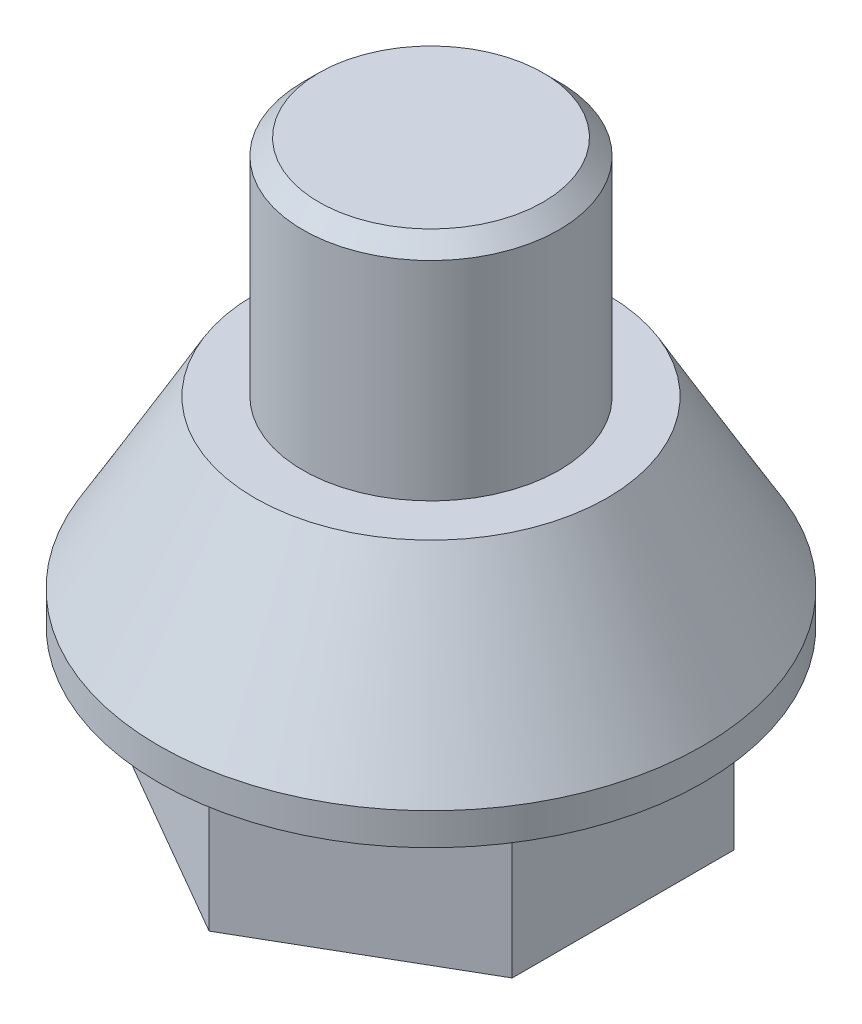
ISO-10303-21;
HEADER;
FILE_DESCRIPTION(('STEP AP214'),'2;1');
FILE_NAME('part.step','',(''),(''),'','','');
FILE_SCHEMA(('AUTOMOTIVE_DESIGN { 1 0 10303 214 1 1 1 1 }'));
ENDSEC;
DATA;
#1=APPLICATION_CONTEXT('core data for automotive mechanical design processes');
#2=APPLICATION_PROTOCOL_DEFINITION('international standard','automotive_design',2000,#1);
#3=PRODUCT_CONTEXT('',#1,'mechanical');
#4=PRODUCT('Part','Part','',(#3));
#5=PRODUCT_RELATED_PRODUCT_CATEGORY('part','',(#4));
#6=PRODUCT_DEFINITION_FORMATION('','',#4);
#7=PRODUCT_DEFINITION_CONTEXT('part definition',#1,'design');
#8=PRODUCT_DEFINITION('design','',#6,#7);
#9=PRODUCT_DEFINITION_SHAPE('','',#8);
#10=(LENGTH_UNIT() NAMED_UNIT(*) SI_UNIT(.MILLI.,.METRE.));
#11=(NAMED_UNIT(*) PLANE_ANGLE_UNIT() SI_UNIT($,.RADIAN.));
#12=(NAMED_UNIT(*) SI_UNIT($,.STERADIAN.) SOLID_ANGLE_UNIT());
#13=UNCERTAINTY_MEASURE_WITH_UNIT(LENGTH_MEASURE(1.E-05),#10,'distance_accuracy_value','');
#14=(GEOMETRIC_REPRESENTATION_CONTEXT(3) GLOBAL_UNCERTAINTY_ASSIGNED_CONTEXT((#13)) GLOBAL_UNIT_ASSIGNED_CONTEXT((#10,
#11,#12)) REPRESENTATION_CONTEXT('',''));
#15=CARTESIAN_POINT('',(0.,0.,0.));
#16=DIRECTION('',(0.,0.,1.));
#17=DIRECTION('',(1.,0.,0.));
#18=AXIS2_PLACEMENT_3D('',#15,#16,#17);
#19=CARTESIAN_POINT('',(-6.00000000000002,4.8,-3.46410161513769));
#20=DIRECTION('',(0.500000000000005,0.,0.866025403784436));
#21=DIRECTION('',(0.866025403784436,0.,-0.500000000000005));
#22=AXIS2_PLACEMENT_3D('',#19,#20,#21);
#23=PLANE('',#22);
#24=DIRECTION('',(-0.866025403784436,0.,0.500000000000005));
#25=VECTOR('',#24,1.);
#26=CARTESIAN_POINT('',(-6.00000000000002,0.,-3.46410161513769));
#27=LINE('',#26,#25);
#28=CARTESIAN_POINT('',(0.,0.,-6.9282032302755));
#29=VERTEX_POINT('',#28);
#30=CARTESIAN_POINT('',(-6.00000000000002,0.,-3.46410161513769));
#31=VERTEX_POINT('',#30);
#32=EDGE_CURVE('E147',#29,#31,#27,.T.);
#33=ORIENTED_EDGE('',*,*,#32,.T.);
#34=DIRECTION('',(0.,-1.,0.));
#35=VECTOR('',#34,1.);
#36=CARTESIAN_POINT('',(-6.00000000000002,4.8,-3.46410161513769));
#37=LINE('',#36,#35);
#38=CARTESIAN_POINT('',(-6.00000000000002,4.8,-3.46410161513769));
#39=VERTEX_POINT('',#38);
#40=EDGE_CURVE('E172',#39,#31,#37,.T.);
#41=ORIENTED_EDGE('',*,*,#40,.F.);
#42=DIRECTION('',(-0.866025403784436,0.,0.500000000000005));
#43=VECTOR('',#42,1.);
#44=CARTESIAN_POINT('',(-6.00000000000002,4.8,-3.46410161513769));
#45=LINE('',#44,#43);
#46=CARTESIAN_POINT('',(0.,4.8,-6.9282032302755));
#47=VERTEX_POINT('',#46);
#48=EDGE_CURVE('E137',#47,#39,#45,.T.);
#49=ORIENTED_EDGE('',*,*,#48,.F.);
#50=DIRECTION('',(0.,-1.,0.));
#51=VECTOR('',#50,1.);
#52=CARTESIAN_POINT('',(0.,4.8,-6.9282032302755));
#53=LINE('',#52,#51);
#54=EDGE_CURVE('E146',#47,#29,#53,.T.);
#55=ORIENTED_EDGE('',*,*,#54,.T.);
#56=EDGE_LOOP('',(#33,#41,#49,#55));
#57=FACE_BOUND('',#56,.T.);
#58=ADVANCED_FACE('F45',(#57),#23,.F.);
#59=CARTESIAN_POINT('',(-5.99999999999997,4.8,3.46410161513778));
#60=DIRECTION('',(1.,0.,0.));
#61=DIRECTION('',(0.,0.,-1.));
#62=AXIS2_PLACEMENT_3D('',#59,#60,#61);
#63=PLANE('',#62);
#64=DIRECTION('',(0.,0.,1.));
#65=VECTOR('',#64,1.);
#66=CARTESIAN_POINT('',(-5.99999999999997,0.,3.46410161513778));
#67=LINE('',#66,#65);
#68=CARTESIAN_POINT('',(-5.99999999999997,0.,3.46410161513778));
#69=VERTEX_POINT('',#68);
#70=EDGE_CURVE('E151',#31,#69,#67,.T.);
#71=ORIENTED_EDGE('',*,*,#70,.T.);
#72=DIRECTION('',(0.,-1.,0.));
#73=VECTOR('',#72,1.);
#74=CARTESIAN_POINT('',(-5.99999999999997,4.8,3.46410161513778));
#75=LINE('',#74,#73);
#76=CARTESIAN_POINT('',(-5.99999999999997,4.8,3.46410161513778));
#77=VERTEX_POINT('',#76);
#78=EDGE_CURVE('E120',#77,#69,#75,.T.);
#79=ORIENTED_EDGE('',*,*,#78,.F.);
#80=DIRECTION('',(0.,0.,1.));
#81=VECTOR('',#80,1.);
#82=CARTESIAN_POINT('',(-5.99999999999997,4.8,3.46410161513778));
#83=LINE('',#82,#81);
#84=EDGE_CURVE('E101',#39,#77,#83,.T.);
#85=ORIENTED_EDGE('',*,*,#84,.F.);
#86=ORIENTED_EDGE('',*,*,#40,.T.);
#87=EDGE_LOOP('',(#71,#79,#85,#86));
#88=FACE_BOUND('',#87,.T.);
#89=ADVANCED_FACE('F191',(#88),#63,.F.);
#90=CARTESIAN_POINT('',(0.,4.8,6.9282032302755));
#91=DIRECTION('',(0.499999999999997,0.,-0.86602540378444));
#92=DIRECTION('',(-0.86602540378444,0.,-0.499999999999997));
#93=AXIS2_PLACEMENT_3D('',#90,#91,#92);
#94=PLANE('',#93);
#95=DIRECTION('',(0.86602540378444,0.,0.499999999999997));
#96=VECTOR('',#95,1.);
#97=CARTESIAN_POINT('',(0.,0.,6.9282032302755));
#98=LINE('',#97,#96);
#99=CARTESIAN_POINT('',(0.,0.,6.9282032302755));
#100=VERTEX_POINT('',#99);
#101=EDGE_CURVE('E116',#69,#100,#98,.T.);
#102=ORIENTED_EDGE('',*,*,#101,.T.);
#103=DIRECTION('',(0.,-1.,0.));
#104=VECTOR('',#103,1.);
#105=CARTESIAN_POINT('',(0.,4.8,6.9282032302755));
#106=LINE('',#105,#104);
#107=CARTESIAN_POINT('',(0.,4.8,6.9282032302755));
#108=VERTEX_POINT('',#107);
#109=EDGE_CURVE('E109',#108,#100,#106,.T.);
#110=ORIENTED_EDGE('',*,*,#109,.F.);
#111=DIRECTION('',(0.86602540378444,0.,0.499999999999997));
#112=VECTOR('',#111,1.);
#113=CARTESIAN_POINT('',(0.,4.8,6.9282032302755));
#114=LINE('',#113,#112);
#115=EDGE_CURVE('E114',#77,#108,#114,.T.);
#116=ORIENTED_EDGE('',*,*,#115,.F.);
#117=ORIENTED_EDGE('',*,*,#78,.T.);
#118=EDGE_LOOP('',(#102,#110,#116,#117));
#119=FACE_BOUND('',#118,.T.);
#120=ADVANCED_FACE('F111',(#119),#94,.F.);
#121=CARTESIAN_POINT('',(6.00000000000003,4.8,3.46410161513769));
#122=DIRECTION('',(-0.500000000000005,0.,-0.866025403784436));
#123=DIRECTION('',(-0.866025403784436,0.,0.500000000000005));
#124=AXIS2_PLACEMENT_3D('',#121,#122,#123);
#125=PLANE('',#124);
#126=DIRECTION('',(0.866025403784436,0.,-0.500000000000005));
#127=VECTOR('',#126,1.);
#128=CARTESIAN_POINT('',(6.00000000000003,0.,3.46410161513769));
#129=LINE('',#128,#127);
#130=CARTESIAN_POINT('',(6.00000000000003,0.,3.46410161513769));
#131=VERTEX_POINT('',#130);
#132=EDGE_CURVE('E157',#100,#131,#129,.T.);
#133=ORIENTED_EDGE('',*,*,#132,.T.);
#134=DIRECTION('',(0.,-1.,0.));
#135=VECTOR('',#134,1.);
#136=CARTESIAN_POINT('',(6.00000000000003,4.8,3.46410161513769));
#137=LINE('',#136,#135);
#138=CARTESIAN_POINT('',(6.00000000000003,4.8,3.46410161513769));
#139=VERTEX_POINT('',#138);
#140=EDGE_CURVE('E121',#139,#131,#137,.T.);
#141=ORIENTED_EDGE('',*,*,#140,.F.);
#142=DIRECTION('',(0.866025403784436,0.,-0.500000000000005));
#143=VECTOR('',#142,1.);
#144=CARTESIAN_POINT('',(6.00000000000003,4.8,3.46410161513769));
#145=LINE('',#144,#143);
#146=EDGE_CURVE('E124',#108,#139,#145,.T.);
#147=ORIENTED_EDGE('',*,*,#146,.F.);
#148=ORIENTED_EDGE('',*,*,#109,.T.);
#149=EDGE_LOOP('',(#133,#141,#147,#148));
#150=FACE_BOUND('',#149,.T.);
#151=ADVANCED_FACE('F125',(#150),#125,.F.);
#152=CARTESIAN_POINT('',(5.99999999999997,4.8,-3.46410161513778));
#153=DIRECTION('',(-1.,0.,0.));
#154=DIRECTION('',(0.,0.,1.));
#155=AXIS2_PLACEMENT_3D('',#152,#153,#154);
#156=PLANE('',#155);
#157=DIRECTION('',(0.,0.,-1.));
#158=VECTOR('',#157,1.);
#159=CARTESIAN_POINT('',(5.99999999999997,0.,-3.46410161513778));
#160=LINE('',#159,#158);
#161=CARTESIAN_POINT('',(5.99999999999997,0.,-3.46410161513778));
#162=VERTEX_POINT('',#161);
#163=EDGE_CURVE('E86',#131,#162,#160,.T.);
#164=ORIENTED_EDGE('',*,*,#163,.T.);
#165=DIRECTION('',(0.,-1.,0.));
#166=VECTOR('',#165,1.);
#167=CARTESIAN_POINT('',(5.99999999999997,4.8,-3.46410161513778));
#168=LINE('',#167,#166);
#169=CARTESIAN_POINT('',(5.99999999999997,4.8,-3.46410161513778));
#170=VERTEX_POINT('',#169);
#171=EDGE_CURVE('E64',#170,#162,#168,.T.);
#172=ORIENTED_EDGE('',*,*,#171,.F.);
#173=DIRECTION('',(0.,0.,-1.));
#174=VECTOR('',#173,1.);
#175=CARTESIAN_POINT('',(5.99999999999997,4.8,-3.46410161513778));
#176=LINE('',#175,#174);
#177=EDGE_CURVE('E129',#139,#170,#176,.T.);
#178=ORIENTED_EDGE('',*,*,#177,.F.);
#179=ORIENTED_EDGE('',*,*,#140,.T.);
#180=EDGE_LOOP('',(#164,#172,#178,#179));
#181=FACE_BOUND('',#180,.T.);
#182=ADVANCED_FACE('F202',(#181),#156,.F.);
#183=CARTESIAN_POINT('',(0.,4.8,-6.9282032302755));
#184=DIRECTION('',(-0.499999999999997,0.,0.86602540378444));
#185=DIRECTION('',(0.86602540378444,0.,0.499999999999997));
#186=AXIS2_PLACEMENT_3D('',#183,#184,#185);
#187=PLANE('',#186);
#188=DIRECTION('',(-0.86602540378444,0.,-0.499999999999997));
#189=VECTOR('',#188,1.);
#190=CARTESIAN_POINT('',(0.,0.,-6.9282032302755));
#191=LINE('',#190,#189);
#192=EDGE_CURVE('E92',#162,#29,#191,.T.);
#193=ORIENTED_EDGE('',*,*,#192,.T.);
#194=ORIENTED_EDGE('',*,*,#54,.F.);
#195=DIRECTION('',(-0.86602540378444,0.,-0.499999999999997));
#196=VECTOR('',#195,1.);
#197=CARTESIAN_POINT('',(0.,4.8,-6.9282032302755));
#198=LINE('',#197,#196);
#199=EDGE_CURVE('E143',#170,#47,#198,.T.);
#200=ORIENTED_EDGE('',*,*,#199,.F.);
#201=ORIENTED_EDGE('',*,*,#171,.T.);
#202=EDGE_LOOP('',(#193,#194,#200,#201));
#203=FACE_BOUND('',#202,.T.);
#204=ADVANCED_FACE('F205',(#203),#187,.F.);
#205=CARTESIAN_POINT('',(0.,0.,0.));
#206=DIRECTION('',(0.,-1.,0.));
#207=DIRECTION('',(0.,0.,-1.));
#208=AXIS2_PLACEMENT_3D('',#205,#206,#207);
#209=PLANE('',#208);
#210=ORIENTED_EDGE('',*,*,#32,.F.);
#211=ORIENTED_EDGE('',*,*,#192,.F.);
#212=ORIENTED_EDGE('',*,*,#163,.F.);
#213=ORIENTED_EDGE('',*,*,#132,.F.);
#214=ORIENTED_EDGE('',*,*,#101,.F.);
#215=ORIENTED_EDGE('',*,*,#70,.F.);
#216=EDGE_LOOP('',(#210,#211,#212,#213,#214,#215));
#217=FACE_BOUND('',#216,.T.);
#218=ADVANCED_FACE('F208',(#217),#209,.T.);
#219=CARTESIAN_POINT('',(0.,4.8,0.));
#220=DIRECTION('',(0.,1.,0.));
#221=DIRECTION('',(0.,0.,1.));
#222=AXIS2_PLACEMENT_3D('',#219,#220,#221);
#223=PLANE('',#222);
#224=CARTESIAN_POINT('',(0.,4.8,0.));
#225=DIRECTION('',(0.,1.,0.));
#226=DIRECTION('',(0.,0.,1.));
#227=AXIS2_PLACEMENT_3D('',#224,#225,#226);
#228=CIRCLE('',#227,8.5);
#229=CARTESIAN_POINT('',(0.,4.8,8.5));
#230=VERTEX_POINT('',#229);
#231=EDGE_CURVE('E344',#230,#230,#228,.T.);
#232=ORIENTED_EDGE('',*,*,#231,.F.);
#233=EDGE_LOOP('',(#232));
#234=FACE_BOUND('',#233,.T.);
#235=ORIENTED_EDGE('',*,*,#199,.T.);
#236=ORIENTED_EDGE('',*,*,#48,.T.);
#237=ORIENTED_EDGE('',*,*,#84,.T.);
#238=ORIENTED_EDGE('',*,*,#115,.T.);
#239=ORIENTED_EDGE('',*,*,#146,.T.);
#240=ORIENTED_EDGE('',*,*,#177,.T.);
#241=EDGE_LOOP('',(#235,#236,#237,#238,#239,#240));
#242=FACE_BOUND('',#241,.T.);
#243=ADVANCED_FACE('F132',(#234,#242),#223,.F.);
#244=CARTESIAN_POINT('',(0.,5.8,0.));
#245=DIRECTION('',(0.,-1.,0.));
#246=DIRECTION('',(0.,0.,-1.));
#247=AXIS2_PLACEMENT_3D('',#244,#245,#246);
#248=CYLINDRICAL_SURFACE('',#247,8.5);
#249=CARTESIAN_POINT('',(0.,5.8,0.));
#250=DIRECTION('',(0.,1.,0.));
#251=DIRECTION('',(0.,0.,1.));
#252=AXIS2_PLACEMENT_3D('',#249,#250,#251);
#253=CIRCLE('',#252,8.5);
#254=CARTESIAN_POINT('',(0.,5.8,8.5));
#255=VERTEX_POINT('',#254);
#256=EDGE_CURVE('E152',#255,#255,#253,.T.);
#257=ORIENTED_EDGE('',*,*,#256,.F.);
#258=EDGE_LOOP('',(#257));
#259=FACE_BOUND('',#258,.T.);
#260=ORIENTED_EDGE('',*,*,#231,.T.);
#261=EDGE_LOOP('',(#260));
#262=FACE_BOUND('',#261,.T.);
#263=ADVANCED_FACE('F212',(#259,#262),#248,.T.);
#264=CARTESIAN_POINT('',(0.,5.8,0.));
#265=DIRECTION('',(0.,-1.,0.));
#266=DIRECTION('',(1.,0.,0.));
#267=AXIS2_PLACEMENT_3D('',#264,#265,#266);
#268=CONICAL_SURFACE('',#267,8.5,0.523598775598304);
#269=CARTESIAN_POINT('',(0.,10.9961524227066,0.));
#270=DIRECTION('',(0.,-1.,0.));
#271=DIRECTION('',(1.,0.,0.));
#272=AXIS2_PLACEMENT_3D('',#269,#270,#271);
#273=CIRCLE('',#272,5.5);
#274=CARTESIAN_POINT('',(5.5,10.9961524227066,0.));
#275=VERTEX_POINT('',#274);
#276=EDGE_CURVE('E342',#275,#275,#273,.T.);
#277=ORIENTED_EDGE('',*,*,#276,.T.);
#278=EDGE_LOOP('',(#277));
#279=FACE_BOUND('',#278,.T.);
#280=ORIENTED_EDGE('',*,*,#256,.T.);
#281=EDGE_LOOP('',(#280));
#282=FACE_BOUND('',#281,.T.);
#283=ADVANCED_FACE('F215',(#279,#282),#268,.T.);
#284=CARTESIAN_POINT('',(5.5,10.9961524227066,0.));
#285=DIRECTION('',(0.,1.,0.));
#286=DIRECTION('',(-1.,0.,0.));
#287=AXIS2_PLACEMENT_3D('',#284,#285,#286);
#288=PLANE('',#287);
#289=CARTESIAN_POINT('',(0.,10.9961524227066,0.));
#290=DIRECTION('',(0.,-1.,0.));
#291=DIRECTION('',(1.,0.,0.));
#292=AXIS2_PLACEMENT_3D('',#289,#290,#291);
#293=CIRCLE('',#292,4.);
#294=CARTESIAN_POINT('',(4.,10.9961524227066,0.));
#295=VERTEX_POINT('',#294);
#296=EDGE_CURVE('E339',#295,#295,#293,.T.);
#297=ORIENTED_EDGE('',*,*,#296,.T.);
#298=EDGE_LOOP('',(#297));
#299=FACE_BOUND('',#298,.T.);
#300=ORIENTED_EDGE('',*,*,#276,.F.);
#301=EDGE_LOOP('',(#300));
#302=FACE_BOUND('',#301,.T.);
#303=ADVANCED_FACE('F222',(#299,#302),#288,.T.);
#304=CARTESIAN_POINT('',(0.,5.8,0.));
#305=DIRECTION('',(0.,-1.,0.));
#306=DIRECTION('',(1.,0.,0.));
#307=AXIS2_PLACEMENT_3D('',#304,#305,#306);
#308=CYLINDRICAL_SURFACE('',#307,4.);
#309=CARTESIAN_POINT('',(0.,17.4961524227066,0.));
#310=DIRECTION('',(0.,1.,0.));
#311=DIRECTION('',(-1.,0.,0.));
#312=AXIS2_PLACEMENT_3D('',#309,#310,#311);
#313=CIRCLE('',#312,4.);
#314=CARTESIAN_POINT('',(-4.,17.4961524227066,0.));
#315=VERTEX_POINT('',#314);
#316=EDGE_CURVE('E56',#315,#315,#313,.F.);
#317=ORIENTED_EDGE('',*,*,#316,.T.);
#318=EDGE_LOOP('',(#317));
#319=FACE_BOUND('',#318,.T.);
#320=ORIENTED_EDGE('',*,*,#296,.F.);
#321=EDGE_LOOP('',(#320));
#322=FACE_BOUND('',#321,.T.);
#323=ADVANCED_FACE('F178',(#319,#322),#308,.T.);
#324=CARTESIAN_POINT('',(4.,17.9961524227066,0.));
#325=DIRECTION('',(0.,1.,0.));
#326=DIRECTION('',(-1.,0.,0.));
#327=AXIS2_PLACEMENT_3D('',#324,#325,#326);
#328=PLANE('',#327);
#329=CARTESIAN_POINT('',(0.,17.9961524227066,0.));
#330=DIRECTION('',(0.,1.,0.));
#331=DIRECTION('',(-1.,0.,0.));
#332=AXIS2_PLACEMENT_3D('',#329,#330,#331);
#333=CIRCLE('',#332,3.49999999999999);
#334=CARTESIAN_POINT('',(-3.49999999999999,17.9961524227066,0.));
#335=VERTEX_POINT('',#334);
#336=EDGE_CURVE('E11',#335,#335,#333,.T.);
#337=ORIENTED_EDGE('',*,*,#336,.T.);
#338=EDGE_LOOP('',(#337));
#339=FACE_BOUND('',#338,.T.);
#340=ADVANCED_FACE('F182',(#339),#328,.T.);
#341=CARTESIAN_POINT('',(0.,17.4961524227066,0.));
#342=DIRECTION('',(0.,-1.,0.));
#343=DIRECTION('',(1.,0.,0.));
#344=AXIS2_PLACEMENT_3D('',#341,#342,#343);
#345=CONICAL_SURFACE('',#344,4.,0.785398163397455);
#346=ORIENTED_EDGE('',*,*,#336,.F.);
#347=EDGE_LOOP('',(#346));
#348=FACE_BOUND('',#347,.T.);
#349=ORIENTED_EDGE('',*,*,#316,.F.);
#350=EDGE_LOOP('',(#349));
#351=FACE_BOUND('',#350,.T.);
#352=ADVANCED_FACE('F48',(#348,#351),#345,.T.);
#353=CLOSED_SHELL('',(#58,#89,#120,#151,#182,#204,#218,#243,#263,#283,#303,#323,#340,#352));
#354=MANIFOLD_SOLID_BREP('B2',#353);
#355=ADVANCED_BREP_SHAPE_REPRESENTATION('',(#18,#354),#14);
#356=SHAPE_DEFINITION_REPRESENTATION(#9,#355);
ENDSEC;
END-ISO-10303-21;
